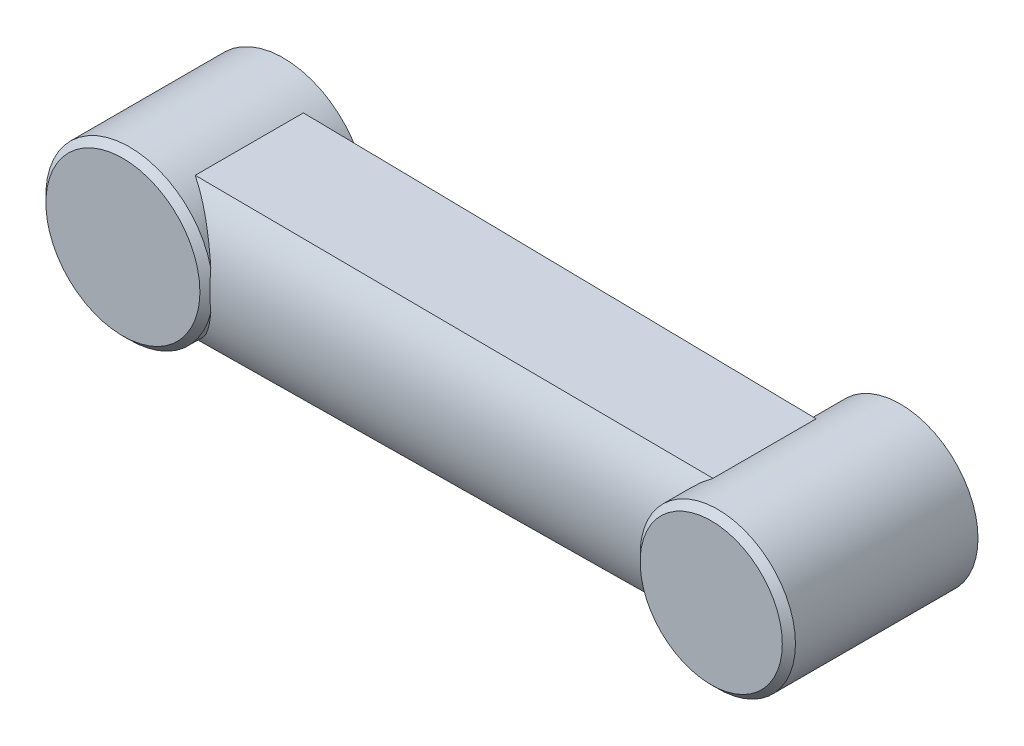
ISO-10303-21;
HEADER;
FILE_DESCRIPTION(('STEP AP214'),'2;1');
FILE_NAME('part.step','',(''),(''),'','','');
FILE_SCHEMA(('AUTOMOTIVE_DESIGN { 1 0 10303 214 1 1 1 1 }'));
ENDSEC;
DATA;
#1=APPLICATION_CONTEXT('core data for automotive mechanical design processes');
#2=APPLICATION_PROTOCOL_DEFINITION('international standard','automotive_design',2000,#1);
#3=PRODUCT_CONTEXT('',#1,'mechanical');
#4=PRODUCT('Part','Part','',(#3));
#5=PRODUCT_RELATED_PRODUCT_CATEGORY('part','',(#4));
#6=PRODUCT_DEFINITION_FORMATION('','',#4);
#7=PRODUCT_DEFINITION_CONTEXT('part definition',#1,'design');
#8=PRODUCT_DEFINITION('design','',#6,#7);
#9=PRODUCT_DEFINITION_SHAPE('','',#8);
#10=(LENGTH_UNIT() NAMED_UNIT(*) SI_UNIT(.MILLI.,.METRE.));
#11=(NAMED_UNIT(*) PLANE_ANGLE_UNIT() SI_UNIT($,.RADIAN.));
#12=(NAMED_UNIT(*) SI_UNIT($,.STERADIAN.) SOLID_ANGLE_UNIT());
#13=UNCERTAINTY_MEASURE_WITH_UNIT(LENGTH_MEASURE(1.E-05),#10,'distance_accuracy_value','');
#14=(GEOMETRIC_REPRESENTATION_CONTEXT(3) GLOBAL_UNCERTAINTY_ASSIGNED_CONTEXT((#13)) GLOBAL_UNIT_ASSIGNED_CONTEXT((#10,
#11,#12)) REPRESENTATION_CONTEXT('',''));
#15=CARTESIAN_POINT('',(0.,0.,0.));
#16=DIRECTION('',(0.,0.,1.));
#17=DIRECTION('',(1.,0.,0.));
#18=AXIS2_PLACEMENT_3D('',#15,#16,#17);
#19=CARTESIAN_POINT('',(0.,0.,-61.));
#20=DIRECTION('',(0.,0.,1.));
#21=DIRECTION('',(1.,0.,0.));
#22=AXIS2_PLACEMENT_3D('',#19,#20,#21);
#23=CYLINDRICAL_SURFACE('',#22,63.5);
#24=CARTESIAN_POINT('',(61.7836507927688,-14.6639181229712,56.));
#25=CARTESIAN_POINT('',(61.648599708457,-15.2329349138538,55.9081096489877));
#26=CARTESIAN_POINT('',(61.5058805607978,-15.7992618023809,55.8111330407212));
#27=CARTESIAN_POINT('',(61.205369992256,-16.9260951506808,55.6073498298629));
#28=CARTESIAN_POINT('',(61.0475791669996,-17.4866018394956,55.5005436157389));
#29=CARTESIAN_POINT('',(60.5523902408362,-19.1574069130503,55.1661611657198));
#30=CARTESIAN_POINT('',(60.1928373582026,-20.2584122556794,54.924390105969));
#31=CARTESIAN_POINT('',(59.417272090624,-22.4314192917344,54.4060788828777));
#32=CARTESIAN_POINT('',(59.0012779951845,-23.5034302462447,54.1295499847762));
#33=CARTESIAN_POINT('',(58.1176008499438,-25.6103993271792,53.5462526207637));
#34=CARTESIAN_POINT('',(57.6502020191451,-26.6455230707687,53.2396513539814));
#35=CARTESIAN_POINT('',(56.6643880440222,-28.6823586781904,52.597913240159));
#36=CARTESIAN_POINT('',(56.1459607726053,-29.6840625235618,52.2627696124868));
#37=CARTESIAN_POINT('',(55.0606092195765,-31.6518877061413,51.5674321038602));
#38=CARTESIAN_POINT('',(54.4936827410106,-32.618007428594,51.2072370882474));
#39=CARTESIAN_POINT('',(53.3162045089535,-34.508948662652,50.4669929407446));
#40=CARTESIAN_POINT('',(52.705851992297,-35.43393068511,50.0870363932428));
#41=CARTESIAN_POINT('',(51.4415188796073,-37.2456753985094,49.3093232153491));
#42=CARTESIAN_POINT('',(50.787541022047,-38.1324404826832,48.911567702758));
#43=CARTESIAN_POINT('',(49.4378008508712,-39.8667957088694,48.1016409412243));
#44=CARTESIAN_POINT('',(48.7420356466458,-40.7143831336017,47.6894686958398));
#45=CARTESIAN_POINT('',(47.3099576867711,-42.3699991378008,46.853839112169));
#46=CARTESIAN_POINT('',(46.5736151317401,-43.1779977986145,46.430373601298));
#47=CARTESIAN_POINT('',(45.0623733214056,-44.7529161066624,45.5762645822608));
#48=CARTESIAN_POINT('',(44.287477486905,-45.5198393859895,45.1456217131831));
#49=CARTESIAN_POINT('',(42.7004908814915,-47.0117409487852,44.2810581898336));
#50=CARTESIAN_POINT('',(41.8884107179383,-47.7367310623682,43.8471384994552));
#51=CARTESIAN_POINT('',(40.4935347604892,-48.9190305082146,43.1185984777713));
#52=CARTESIAN_POINT('',(39.9204812806935,-49.387788233219,42.8238149059094));
#53=CARTESIAN_POINT('',(38.7579424323339,-50.3052689075127,42.2358477801488));
#54=CARTESIAN_POINT('',(38.168460263094,-50.7539957139495,41.9426639278359));
#55=CARTESIAN_POINT('',(36.9748487839182,-51.6300025919728,41.359964940018));
#56=CARTESIAN_POINT('',(36.3707636056516,-52.0573376045213,41.0704420028054));
#57=CARTESIAN_POINT('',(35.1465078677639,-52.8916017941842,40.4955829675822));
#58=CARTESIAN_POINT('',(34.5263339579162,-53.2985266686103,40.2102477612865));
#59=CARTESIAN_POINT('',(33.8982909099262,-53.6950265237481,39.9277307044227));
#60=B_SPLINE_CURVE_WITH_KNOTS('',3,(#24,#25,#26,#27,#28,#29,#30,#31,#32,#33,#34,#35,#36,#37,#38,
#39,#40,#41,#42,#43,#44,#45,#46,#47,#48,#49,#50,#51,#52,#53,#54,#55,#56,#57,#58,#59),
.UNSPECIFIED.,.F.,.F.,(4,2,2,2,2,2,2,2,2,2,2,2,2,2,2,2,2,4),(0.,1.7758306915689,
3.55159123208076,7.09868103501052,10.6446241534672,14.1718634038235,17.6999429485802,
21.2281823956738,24.7411656383265,28.2539285692867,31.7669347736264,35.282556178013,
38.7978661983946,42.3121795989563,44.7024416456266,47.0922414210103,49.4755502822629,
51.8593594783057),.UNSPECIFIED.);
#61=CARTESIAN_POINT('',(61.7836507927688,-14.6639181229711,56.));
#62=VERTEX_POINT('',#61);
#63=CARTESIAN_POINT('',(33.8982909099262,-53.6950265237481,39.9277307044227));
#64=VERTEX_POINT('',#63);
#65=EDGE_CURVE('E185',#62,#64,#60,.T.);
#66=ORIENTED_EDGE('',*,*,#65,.F.);
#67=CARTESIAN_POINT('',(0.,0.,56.));
#68=DIRECTION('',(0.,0.,1.));
#69=DIRECTION('',(1.,0.,0.));
#70=AXIS2_PLACEMENT_3D('',#67,#68,#69);
#71=CIRCLE('',#70,63.5);
#72=CARTESIAN_POINT('',(61.7836507927688,14.6639181229709,56.));
#73=VERTEX_POINT('',#72);
#74=EDGE_CURVE('E229',#62,#73,#71,.F.);
#75=ORIENTED_EDGE('',*,*,#74,.T.);
#76=CARTESIAN_POINT('',(33.8982909099263,53.695026523748,39.9277307044227));
#77=CARTESIAN_POINT('',(34.6854697356567,53.1980495854552,40.281847356795));
#78=CARTESIAN_POINT('',(35.4602930454346,52.6847059542092,40.6403734810635));
#79=CARTESIAN_POINT('',(36.9849087142456,51.6258531577822,41.3636142717385));
#80=CARTESIAN_POINT('',(37.7346964681527,51.0803381253771,41.7283300582858));
#81=CARTESIAN_POINT('',(39.2087424421234,49.9578091687501,42.4612427714828));
#82=CARTESIAN_POINT('',(39.9329968458493,49.3807905684259,42.8294402081741));
#83=CARTESIAN_POINT('',(41.3553781887673,48.1958464111372,43.566752900685));
#84=CARTESIAN_POINT('',(42.0535033016067,47.5879187007045,43.9358682187456));
#85=CARTESIAN_POINT('',(43.4304029852933,46.3349319083394,44.6765401287394));
#86=CARTESIAN_POINT('',(44.1088850914266,45.6895412914754,45.0480797026258));
#87=CARTESIAN_POINT('',(45.4377058514202,44.3682626486409,45.7870903998418));
#88=CARTESIAN_POINT('',(46.0880460995222,43.692376354699,46.1545617527569));
#89=CARTESIAN_POINT('',(47.3597500724767,42.3105851675989,46.8830128553344));
#90=CARTESIAN_POINT('',(47.981115675076,41.6046822254005,47.2439930247339));
#91=CARTESIAN_POINT('',(49.1939225030848,40.1633552652555,47.9571502523404));
#92=CARTESIAN_POINT('',(49.7853635838568,39.4279311046516,48.3093272679939));
#93=CARTESIAN_POINT('',(51.1317334584608,37.6748665861015,49.119834839902));
#94=CARTESIAN_POINT('',(51.874433073056,36.6457816999869,49.5738561529566));
#95=CARTESIAN_POINT('',(53.301335276781,34.5374870647286,50.4570774228577));
#96=CARTESIAN_POINT('',(53.9855338052523,33.4582738441039,50.8862756560247));
#97=CARTESIAN_POINT('',(55.2922877211038,31.2515223427374,51.7146853505287));
#98=CARTESIAN_POINT('',(55.914825308247,30.1239702413805,52.1138881448218));
#99=CARTESIAN_POINT('',(57.0907124871832,27.8307405113999,52.8743298102404));
#100=CARTESIAN_POINT('',(57.6444764190512,26.6653505299609,53.2357937083359));
#101=CARTESIAN_POINT('',(58.6834885354417,24.2935011993655,53.9189561223194));
#102=CARTESIAN_POINT('',(59.1687555542201,23.0870532533946,54.24066556625));
#103=CARTESIAN_POINT('',(60.0668163734702,20.6379783709302,54.8397311426571));
#104=CARTESIAN_POINT('',(60.4796862583333,19.3953910356553,55.1171338108246));
#105=CARTESIAN_POINT('',(60.9400562821911,17.8507393136768,55.4279251481107));
#106=CARTESIAN_POINT('',(61.0234240375354,17.5636349030207,55.4842743265175));
#107=CARTESIAN_POINT('',(61.1862077736948,16.9878613392096,55.5944194893146));
#108=CARTESIAN_POINT('',(61.2656243827675,16.6991924429648,55.6482158795513));
#109=CARTESIAN_POINT('',(61.4204838349234,16.1202964378687,55.7532183185651));
#110=CARTESIAN_POINT('',(61.4959263343745,15.830069196654,55.8044241433271));
#111=CARTESIAN_POINT('',(61.6428057593379,15.2481009289596,55.9042018535729));
#112=CARTESIAN_POINT('',(61.7142420361099,14.9563596656183,55.9527733124239));
#113=CARTESIAN_POINT('',(61.7836507927688,14.6639181229711,56.));
#114=B_SPLINE_CURVE_WITH_KNOTS('',3,(#76,#77,#78,#79,#80,#81,#82,#83,#84,#85,#86,#87,#88,#89,
#90,#91,#92,#93,#94,#95,#96,#97,#98,#99,#100,#101,#102,#103,#104,#105,#106,#107,#108,#109,#110,
#111,#112,#113),.UNSPECIFIED.,.F.,.F.,(4,2,2,2,2,2,2,2,2,2,2,2,2,2,2,2,2,2,4),(0.,
2.98776415405601,5.97607489355973,8.9648304029641,11.953794428026,14.9752169769856,
17.9964681371023,21.0175232274703,24.038592918438,28.079753339509,32.1211940369662,
36.1637980349664,40.1807249946286,44.1965452792267,48.2081195847804,49.1207847112899,
50.0333042513392,50.9459025657545,51.8586482359199),.UNSPECIFIED.);
#115=CARTESIAN_POINT('',(33.8982909099263,53.6950265237481,39.9277307044227));
#116=VERTEX_POINT('',#115);
#117=EDGE_CURVE('E126',#116,#73,#114,.T.);
#118=ORIENTED_EDGE('',*,*,#117,.F.);
#119=DIRECTION('',(0.,0.,1.));
#120=VECTOR('',#119,1.);
#121=CARTESIAN_POINT('',(33.8982909099263,53.6950265237481,-61.));
#122=LINE('',#121,#120);
#123=CARTESIAN_POINT('',(33.8982909099262,53.6950265237481,-42.2424941420733));
#124=VERTEX_POINT('',#123);
#125=EDGE_CURVE('E142',#124,#116,#122,.T.);
#126=ORIENTED_EDGE('',*,*,#125,.F.);
#127=CARTESIAN_POINT('',(33.8982909099262,-53.6950265237481,-42.2424941420734));
#128=CARTESIAN_POINT('',(34.4193198431348,-53.3660911462127,-42.4380515091542));
#129=CARTESIAN_POINT('',(34.9349983197885,-53.0299347012633,-42.6355872701408));
#130=CARTESIAN_POINT('',(35.9554926568176,-52.3433934662191,-43.0339301537555));
#131=CARTESIAN_POINT('',(36.4603087112985,-51.9930089306959,-43.2347372178143));
#132=CARTESIAN_POINT('',(37.9581821875637,-50.9208631898811,-43.8410210917351));
#133=CARTESIAN_POINT('',(38.9347340185612,-50.1780661987484,-44.2503866828712));
#134=CARTESIAN_POINT('',(40.8419686939464,-48.6383175862318,-45.0740107517417));
#135=CARTESIAN_POINT('',(41.7726493888144,-47.8413634312001,-45.4882694576416));
#136=CARTESIAN_POINT('',(43.5917398396207,-46.1901265128991,-46.3189347748675));
#137=CARTESIAN_POINT('',(44.4798724379297,-45.3355374390936,-46.7353398743647));
#138=CARTESIAN_POINT('',(46.2061097871649,-43.5748254432467,-47.5627939271128));
#139=CARTESIAN_POINT('',(47.0442155720717,-42.6687035870684,-47.9738429909278));
#140=CARTESIAN_POINT('',(48.6683542025277,-40.8064662967915,-48.7856126612031));
#141=CARTESIAN_POINT('',(49.4543857730563,-39.8503496396111,-49.1863330146217));
#142=CARTESIAN_POINT('',(50.9733489899942,-37.8881227875249,-49.9735343490851));
#143=CARTESIAN_POINT('',(51.7061815151839,-36.8819248747386,-50.3599881219915));
#144=CARTESIAN_POINT('',(53.1145419440894,-34.8231372441595,-51.1133543756246));
#145=CARTESIAN_POINT('',(53.7900700594988,-33.7705476977684,-51.4802669285386));
#146=CARTESIAN_POINT('',(55.0810318581592,-31.6212191175855,-52.1900804030294));
#147=CARTESIAN_POINT('',(55.6964628687674,-30.5244781233477,-52.5329802565201));
#148=CARTESIAN_POINT('',(56.8628582475973,-28.292179713211,-53.1894582724638));
#149=CARTESIAN_POINT('',(57.4139698348312,-27.1567189453455,-53.5031030516926));
#150=CARTESIAN_POINT('',(58.4502895238229,-24.8478328099913,-54.097923776957));
#151=CARTESIAN_POINT('',(58.9354990124585,-23.6744082420762,-54.3791004062505));
#152=CARTESIAN_POINT('',(59.8369107502925,-21.2935212100263,-54.9052767867625));
#153=CARTESIAN_POINT('',(60.2531207698379,-20.0860625965648,-55.1502806112262));
#154=CARTESIAN_POINT('',(60.9817421524545,-17.7440779773845,-55.581704682793));
#155=CARTESIAN_POINT('',(61.2999333637755,-16.6119360368338,-55.7713159374953));
#156=CARTESIAN_POINT('',(61.8739563491104,-14.3265980753332,-56.1146551107082));
#157=CARTESIAN_POINT('',(62.1297905256461,-13.1734028673744,-56.2683844116863));
#158=CARTESIAN_POINT('',(62.5773227430765,-10.8502500643327,-56.538041927136));
#159=CARTESIAN_POINT('',(62.7690212513804,-9.68029259147507,-56.6539704170928));
#160=CARTESIAN_POINT('',(63.0868166698778,-7.32876562047388,-56.8466073668139));
#161=CARTESIAN_POINT('',(63.2129385987853,-6.14720072634162,-56.9233307838674));
#162=CARTESIAN_POINT('',(63.3987275925882,-3.7768097649935,-57.0365463894842));
#163=CARTESIAN_POINT('',(63.458393593082,-2.58798358178272,-57.0730379336675));
#164=CARTESIAN_POINT('',(63.4977061552108,-0.803495805736164,-57.0970969873179));
#165=CARTESIAN_POINT('',(63.5024459277678,-0.208458218150453,-57.100003622976));
#166=CARTESIAN_POINT('',(63.4952014789657,0.981473846072471,-57.0955679089904));
#167=CARTESIAN_POINT('',(63.4832178167924,1.57636832682955,-57.088225902033));
#168=CARTESIAN_POINT('',(63.4362652842381,2.94895251278201,-57.0595124181981));
#169=CARTESIAN_POINT('',(63.3953420499829,3.72637049836644,-57.03450920508));
#170=CARTESIAN_POINT('',(63.2850158513729,5.27845720616421,-56.9672390962727));
#171=CARTESIAN_POINT('',(63.2156115582514,6.0531257984052,-56.9249713951197));
#172=CARTESIAN_POINT('',(63.0485627109138,7.59818535259573,-56.8234464236458));
#173=CARTESIAN_POINT('',(62.9509220662756,8.36857689170158,-56.7641915053685));
#174=CARTESIAN_POINT('',(62.7277122249248,9.90383079582678,-56.6290239853894));
#175=CARTESIAN_POINT('',(62.6021428213428,10.6686931198477,-56.5531112603027));
#176=CARTESIAN_POINT('',(62.3234902510483,12.1914512697166,-56.3850439118823));
#177=CARTESIAN_POINT('',(62.1704121919835,12.9493483614154,-56.2928923037518));
#178=CARTESIAN_POINT('',(61.8372128666032,14.4570181859871,-56.0927931730675));
#179=CARTESIAN_POINT('',(61.6570915198393,15.2067908946844,-55.9848456035239));
#180=CARTESIAN_POINT('',(61.0769021918049,17.4422191955904,-55.6382269580365));
#181=CARTESIAN_POINT('',(60.6369594386442,18.9142543445134,-55.3767499039783));
#182=CARTESIAN_POINT('',(59.6532544530383,21.8198162752503,-54.7974987987408));
#183=CARTESIAN_POINT('',(59.1089944009907,23.2531191995297,-54.4794553500636));
#184=CARTESIAN_POINT('',(57.9232754026136,26.0667330368434,-53.7942439005121));
#185=CARTESIAN_POINT('',(57.2818168085849,27.4470441419264,-53.4270760776919));
#186=CARTESIAN_POINT('',(55.9065747720781,30.1497267170657,-52.6501083911692));
#187=CARTESIAN_POINT('',(55.1727193589018,31.4720519256856,-52.2402753377832));
#188=CARTESIAN_POINT('',(53.6182617611562,34.0529236710477,-51.3860310199276));
#189=CARTESIAN_POINT('',(52.7976566611284,35.3114680621584,-50.9416185934568));
#190=CARTESIAN_POINT('',(50.9682622815734,37.9119445006428,-49.9695456408328));
#191=CARTESIAN_POINT('',(49.9487453418842,39.245026654486,-49.4383767543475));
#192=CARTESIAN_POINT('',(47.8124500427596,41.8212960525196,-48.3533216488615));
#193=CARTESIAN_POINT('',(46.6956520170626,43.0644650265319,-47.7994308484477));
#194=CARTESIAN_POINT('',(44.3717691842029,45.4551644302404,-46.6818438240084));
#195=CARTESIAN_POINT('',(43.1647967775747,46.6028102743806,-46.1181604576095));
#196=CARTESIAN_POINT('',(40.6643777328724,48.7998600341714,-44.993118572353));
#197=CARTESIAN_POINT('',(39.3709721081893,49.8493099852208,-44.4317590832071));
#198=CARTESIAN_POINT('',(37.3667719378811,51.3485537256723,-43.6003310687549));
#199=CARTESIAN_POINT('',(36.6867167548055,51.8366390838028,-43.3244607615004));
#200=CARTESIAN_POINT('',(35.3071660184593,52.7859246646202,-42.7786789067284));
#201=CARTESIAN_POINT('',(34.6076959599724,53.2471578909702,-42.508760308992));
#202=CARTESIAN_POINT('',(33.8982909099262,53.6950265237481,-42.2424941420734));
#203=B_SPLINE_CURVE_WITH_KNOTS('',3,(#127,#128,#129,#130,#131,#132,#133,#134,#135,#136,#137,
#138,#139,#140,#141,#142,#143,#144,#145,#146,#147,#148,#149,#150,#151,#152,#153,#154,#155,#156,
#157,#158,#159,#160,#161,#162,#163,#164,#165,#166,#167,#168,#169,#170,#171,#172,#173,#174,#175,
#176,#177,#178,#179,#180,#181,#182,#183,#184,#185,#186,#187,#188,#189,#190,#191,#192,#193,#194,
#195,#196,#197,#198,#199,#200,#201,#202),.UNSPECIFIED.,.F.,.F.,(4,2,2,2,2,2,2,2,2,2,2,2,2,2,2,2,
2,2,2,2,2,2,2,2,2,2,2,2,2,2,2,2,2,2,2,2,2,4),(0.,1.93924289755382,3.87845111309315,
7.7566105210312,11.634951486914,15.5358363765017,19.4366406125941,23.3375403233582,
27.245531007154,31.1535072534453,35.0616572164655,38.9606788021854,42.859618322167,
46.7581184659606,50.3294275656358,53.9005990464393,57.4717445006256,61.0415264932291,
64.6113656609748,66.3962867153382,68.1811480882825,70.5170902385374,72.8531413831559,
75.1888692351261,77.5246143885003,79.8599263015221,82.1952451617718,86.8650588132203,
91.5577389328491,96.2504020440397,100.946743293214,105.643242425884,110.918780162621,
116.195386883765,121.465522765927,126.733175435276,129.376716791021,132.016937250426),.UNSPECIFIED.);
#204=CARTESIAN_POINT('',(33.8982909099262,-53.6950265237481,-42.2424941420734));
#205=VERTEX_POINT('',#204);
#206=EDGE_CURVE('E123',#205,#124,#203,.T.);
#207=ORIENTED_EDGE('',*,*,#206,.F.);
#208=DIRECTION('',(0.,0.,1.));
#209=VECTOR('',#208,1.);
#210=CARTESIAN_POINT('',(33.8982909099263,-53.6950265237481,-61.));
#211=LINE('',#210,#209);
#212=EDGE_CURVE('E138',#64,#205,#211,.F.);
#213=ORIENTED_EDGE('',*,*,#212,.F.);
#214=EDGE_LOOP('',(#66,#75,#118,#126,#207,#213));
#215=FACE_BOUND('',#214,.T.);
#216=CARTESIAN_POINT('',(0.,0.,-61.));
#217=DIRECTION('',(0.,0.,1.));
#218=DIRECTION('',(1.,0.,0.));
#219=AXIS2_PLACEMENT_3D('',#216,#217,#218);
#220=CIRCLE('',#219,63.5);
#221=CARTESIAN_POINT('',(63.5,0.,-61.));
#222=VERTEX_POINT('',#221);
#223=EDGE_CURVE('E194',#222,#222,#220,.T.);
#224=ORIENTED_EDGE('',*,*,#223,.T.);
#225=EDGE_LOOP('',(#224));
#226=FACE_BOUND('',#225,.T.);
#227=ADVANCED_FACE('F67',(#215,#226),#23,.T.);
#228=CARTESIAN_POINT('',(0.,0.,-61.));
#229=DIRECTION('',(0.,0.,1.));
#230=DIRECTION('',(1.,0.,0.));
#231=AXIS2_PLACEMENT_3D('',#228,#229,#230);
#232=PLANE('',#231);
#233=ORIENTED_EDGE('',*,*,#223,.F.);
#234=EDGE_LOOP('',(#233));
#235=FACE_BOUND('',#234,.T.);
#236=ADVANCED_FACE('F206',(#235),#232,.F.);
#237=CARTESIAN_POINT('',(0.,0.,61.));
#238=DIRECTION('',(0.,0.,1.));
#239=DIRECTION('',(1.,0.,0.));
#240=AXIS2_PLACEMENT_3D('',#237,#238,#239);
#241=PLANE('',#240);
#242=CARTESIAN_POINT('',(0.,0.,61.));
#243=DIRECTION('',(0.,0.,1.));
#244=DIRECTION('',(1.,0.,0.));
#245=AXIS2_PLACEMENT_3D('',#242,#243,#244);
#246=CIRCLE('',#245,58.5);
#247=CARTESIAN_POINT('',(58.5,0.,61.));
#248=VERTEX_POINT('',#247);
#249=EDGE_CURVE('E233',#248,#248,#246,.T.);
#250=ORIENTED_EDGE('',*,*,#249,.T.);
#251=EDGE_LOOP('',(#250));
#252=FACE_BOUND('',#251,.T.);
#253=ADVANCED_FACE('F241',(#252),#241,.T.);
#254=CARTESIAN_POINT('',(0.,0.,61.));
#255=DIRECTION('',(0.,0.,-1.));
#256=DIRECTION('',(-1.,0.,0.));
#257=AXIS2_PLACEMENT_3D('',#254,#255,#256);
#258=CONICAL_SURFACE('',#257,58.5,0.785398163397446);
#259=CARTESIAN_POINT('',(61.7836507927688,14.6639181229709,56.));
#260=CARTESIAN_POINT('',(61.8407626566548,13.8512186319952,56.1321361155011));
#261=CARTESIAN_POINT('',(61.8939292818548,13.0364457935753,56.2532653461482));
#262=CARTESIAN_POINT('',(61.991413962281,11.4068846705121,56.473005578654));
#263=CARTESIAN_POINT('',(62.0357686979293,10.5921111967361,56.5717101829256));
#264=CARTESIAN_POINT('',(62.115033909838,8.96255191725881,56.7469203476471));
#265=CARTESIAN_POINT('',(62.1499762377268,8.14777572711539,56.8235008416445));
#266=CARTESIAN_POINT('',(62.2100450927694,6.51821831827814,56.9546708621001));
#267=CARTESIAN_POINT('',(62.235196793992,5.70344257186914,57.0093167990488));
#268=CARTESIAN_POINT('',(62.2754575432562,4.07388842978492,57.0967312134052));
#269=CARTESIAN_POINT('',(62.2905839470778,3.25911249349375,57.129537500023));
#270=CARTESIAN_POINT('',(62.3107218713122,1.62955729176192,57.1732913075162));
#271=CARTESIAN_POINT('',(62.3157421799362,0.814778645880914,57.1842578200638));
#272=CARTESIAN_POINT('',(62.3157421799362,-0.814778645881092,57.1842578200638));
#273=CARTESIAN_POINT('',(62.3107218713122,-1.62955729176209,57.1732913075162));
#274=CARTESIAN_POINT('',(62.2905839470778,-3.25911249349393,57.129537500023));
#275=CARTESIAN_POINT('',(62.2754575432562,-4.0738884297851,57.0967312134052));
#276=CARTESIAN_POINT('',(62.2351967939919,-5.70344257186931,57.0093167990488));
#277=CARTESIAN_POINT('',(62.2100450927694,-6.51821831827832,56.9546708621001));
#278=CARTESIAN_POINT('',(62.1499762377268,-8.14777572711557,56.8235008416445));
#279=CARTESIAN_POINT('',(62.115033909838,-8.96255191725899,56.7469203476471));
#280=CARTESIAN_POINT('',(62.0357686979293,-10.5921111967363,56.5717101829255));
#281=CARTESIAN_POINT('',(61.9914139622809,-11.4068846705123,56.473005578654));
#282=CARTESIAN_POINT('',(61.8939292818548,-13.0364457935755,56.2532653461482));
#283=CARTESIAN_POINT('',(61.8407626566547,-13.8512186319954,56.1321361155011));
#284=CARTESIAN_POINT('',(61.7836507927688,-14.6639181229711,56.));
#285=B_SPLINE_CURVE_WITH_KNOTS('',3,(#259,#260,#261,#262,#263,#264,#265,#266,#267,#268,#269,
#270,#271,#272,#273,#274,#275,#276,#277,#278,#279,#280,#281,#282,#283,#284),.UNSPECIFIED.,.F.,
.F.,(4,2,2,2,2,2,2,2,2,2,2,2,4),(0.,2.47597327162048,4.94141353579051,7.39840282961465,
9.84903220825436,12.2954079014581,14.7396553177077,17.1839027339573,19.630278427161,
22.0809078058007,24.5378970996249,27.0033373637949,29.4793106354154),.UNSPECIFIED.);
#286=EDGE_CURVE('E219',#73,#62,#285,.T.);
#287=ORIENTED_EDGE('',*,*,#286,.F.);
#288=ORIENTED_EDGE('',*,*,#74,.F.);
#289=EDGE_LOOP('',(#287,#288));
#290=FACE_BOUND('',#289,.T.);
#291=ORIENTED_EDGE('',*,*,#249,.F.);
#292=EDGE_LOOP('',(#291));
#293=FACE_BOUND('',#292,.T.);
#294=ADVANCED_FACE('F209',(#290,#293),#258,.T.);
#295=CARTESIAN_POINT('',(0.,54.,40.0000000000001));
#296=CARTESIAN_POINT('',(457.5,49.884,39.0246351117086));
#297=CARTESIAN_POINT('',(0.,50.3632176310889,42.6502479131541));
#298=CARTESIAN_POINT('',(457.5,46.4673396309022,41.3925626701944));
#299=CARTESIAN_POINT('',(0.,46.4419690343404,45.0959922608288));
#300=CARTESIAN_POINT('',(457.5,42.8042547910275,43.5695694418785));
#301=CARTESIAN_POINT('',(0.,38.1058227124529,49.4272323731624));
#302=CARTESIAN_POINT('',(457.5,35.0550028031443,47.4152670170387));
#303=CARTESIAN_POINT('',(0.,33.6910257714396,51.3120076630332));
#304=CARTESIAN_POINT('',(457.5,30.9689463374208,49.0833943147892));
#305=CARTESIAN_POINT('',(0.,24.4945415257111,54.3890220544597));
#306=CARTESIAN_POINT('',(457.5,22.4850028776516,51.8023708790877));
#307=CARTESIAN_POINT('',(0.,19.7133096845772,55.5806042377026));
#308=CARTESIAN_POINT('',(457.5,18.0874920759603,52.8527190637673));
#309=CARTESIAN_POINT('',(0.,9.95436304152096,57.1805156499968));
#310=CARTESIAN_POINT('',(457.5,9.12637269259752,54.2621906044295));
#311=CARTESIAN_POINT('',(0.,4.97739747283171,57.5884496870806));
#312=CARTESIAN_POINT('',(457.5,4.56335461529508,54.6210168572468));
#313=CARTESIAN_POINT('',(0.,-4.97739747283176,57.5884496870806));
#314=CARTESIAN_POINT('',(457.5,-4.56335461529508,54.6210168572468));
#315=CARTESIAN_POINT('',(0.,-9.95436304152101,57.1805156499968));
#316=CARTESIAN_POINT('',(457.5,-9.12637269259751,54.2621906044295));
#317=CARTESIAN_POINT('',(0.,-19.7133096845772,55.5806042377026));
#318=CARTESIAN_POINT('',(457.5,-18.0874920759603,52.8527190637673));
#319=CARTESIAN_POINT('',(0.,-24.4945415257111,54.3890220544597));
#320=CARTESIAN_POINT('',(457.5,-22.4850028776516,51.8023708790878));
#321=CARTESIAN_POINT('',(0.,-33.6910257714397,51.3120076630332));
#322=CARTESIAN_POINT('',(457.5,-30.9689463374208,49.0833943147892));
#323=CARTESIAN_POINT('',(0.,-38.1058227124529,49.4272323731624));
#324=CARTESIAN_POINT('',(457.5,-35.0550028031443,47.4152670170387));
#325=CARTESIAN_POINT('',(0.,-46.4419690343405,45.0959922608288));
#326=CARTESIAN_POINT('',(457.5,-42.8042547910275,43.5695694418785));
#327=CARTESIAN_POINT('',(0.,-50.3632176310889,42.6502479131541));
#328=CARTESIAN_POINT('',(457.5,-46.4673396309022,41.3925626701944));
#329=CARTESIAN_POINT('',(0.,-54.,40.0000000000001));
#330=CARTESIAN_POINT('',(457.5,-49.884,39.0246351117086));
#331=B_SPLINE_SURFACE_WITH_KNOTS('',3,1,((#295,#296),(#297,#298),(#299,#300),(#301,#302),(#303,
#304),(#305,#306),(#307,#308),(#309,#310),(#311,#312),(#313,#314),(#315,#316),(#317,#318),(#319,
#320),(#321,#322),(#323,#324),(#325,#326),(#327,#328),(#329,#330)),.UNSPECIFIED.,.F.,.F.,.F.,(4,
2,2,2,2,2,2,2,4),(2,2),(0.,0.125,0.25,0.375,0.5,0.625,0.75,0.875,1.),(0.,1.),.UNSPECIFIED.);
#332=CARTESIAN_POINT('',(426.44149360132,50.1634247264196,39.0908501425809));
#333=CARTESIAN_POINT('',(425.950564004929,49.8594626665734,39.3064124434788));
#334=CARTESIAN_POINT('',(425.464695411678,49.5486740197071,39.5237678558516));
#335=CARTESIAN_POINT('',(424.503180731469,48.9136175779557,39.961351190105));
#336=CARTESIAN_POINT('',(424.0275344666,48.5893500179476,40.1815790618856));
#337=CARTESIAN_POINT('',(422.615993685604,47.5965309665746,40.8455408242648));
#338=CARTESIAN_POINT('',(421.695560681071,46.9080024477247,41.2925248075014));
#339=CARTESIAN_POINT('',(419.897300354642,45.4791825354338,42.1895484068698));
#340=CARTESIAN_POINT('',(419.019476956042,44.7388863907279,42.6395883000435));
#341=CARTESIAN_POINT('',(417.301001718189,43.201621947773,43.5410563392584));
#342=CARTESIAN_POINT('',(416.460703513302,42.4042475801873,43.9924667795542));
#343=CARTESIAN_POINT('',(414.826587004295,40.7593398311122,44.8878281663958));
#344=CARTESIAN_POINT('',(414.032766358407,39.9118089810876,45.3317794879638));
#345=CARTESIAN_POINT('',(412.493529881861,38.1676617076354,46.2071621872814));
#346=CARTESIAN_POINT('',(411.748115177548,37.2710441429172,46.6385932735721));
#347=CARTESIAN_POINT('',(410.306225609526,35.4276796612787,47.485383396141));
#348=CARTESIAN_POINT('',(409.609884613587,34.4808071059508,47.9006971787518));
#349=CARTESIAN_POINT('',(408.271023593849,32.5406969758499,48.7093583430143));
#350=CARTESIAN_POINT('',(407.628503831356,31.5474591760073,49.1027056180142));
#351=CARTESIAN_POINT('',(406.400247330097,29.5164983438244,49.8627426353916));
#352=CARTESIAN_POINT('',(405.814514265138,28.4787724395877,50.2294306526689));
#353=CARTESIAN_POINT('',(404.704841388476,26.3645951812797,50.9301815757724));
#354=CARTESIAN_POINT('',(404.180713793445,25.2882752890239,51.2643430625689));
#355=CARTESIAN_POINT('',(403.195561505182,23.0969898379458,51.8971269907541));
#356=CARTESIAN_POINT('',(402.73453464738,21.9820256064022,52.1957506511666));
#357=CARTESIAN_POINT('',(401.879038356439,19.7173357212411,52.7534170314662));
#358=CARTESIAN_POINT('',(401.484557838306,18.5676158947561,53.0124663427934));
#359=CARTESIAN_POINT('',(400.805383868723,16.3674829940292,53.460711308925));
#360=CARTESIAN_POINT('',(400.513357852795,15.3202592110831,53.6544726344595));
#361=CARTESIAN_POINT('',(399.986494099632,13.2054501947417,54.0050522398591));
#362=CARTESIAN_POINT('',(399.751653098036,12.1378661273504,54.1618726284515));
#363=CARTESIAN_POINT('',(399.340995106345,9.9864598449363,54.4367385723474));
#364=CARTESIAN_POINT('',(399.165177532697,8.90263779056583,54.5547845110056));
#365=CARTESIAN_POINT('',(398.874083007363,6.72379574828647,54.7506435615253));
#366=CARTESIAN_POINT('',(398.758778813096,5.62878102595904,54.8284747774504));
#367=CARTESIAN_POINT('',(398.589587326849,3.43174048475749,54.942878438496));
#368=CARTESIAN_POINT('',(398.535701215308,2.32971453153883,54.9794500906192));
#369=CARTESIAN_POINT('',(398.501287866126,0.675562130579819,55.0028212756183));
#370=CARTESIAN_POINT('',(398.497552164226,0.12400816238321,55.0053643314494));
#371=CARTESIAN_POINT('',(398.50554517145,-0.978971097888408,54.9999335483781));
#372=CARTESIAN_POINT('',(398.51727438538,-1.53039638517535,54.9919593661713));
#373=CARTESIAN_POINT('',(398.561552440135,-2.78470665553341,54.9619161240062));
#374=CARTESIAN_POINT('',(398.598957927243,-3.48734736757544,54.9365616744615));
#375=CARTESIAN_POINT('',(398.698799054904,-4.89012173596496,54.869019963432));
#376=CARTESIAN_POINT('',(398.7612380956,-5.59025503870894,54.8268304153497));
#377=CARTESIAN_POINT('',(398.910910424779,-6.98651987385498,54.7258883220418));
#378=CARTESIAN_POINT('',(398.99813859393,-7.68265220226739,54.6671391966416));
#379=CARTESIAN_POINT('',(399.197092234865,-9.06983713103632,54.5333912560067));
#380=CARTESIAN_POINT('',(399.308817977204,-9.76088967520386,54.4583922613063));
#381=CARTESIAN_POINT('',(399.556373890271,-11.1366302747102,54.2925337464617));
#382=CARTESIAN_POINT('',(399.692199970995,-11.8213193892537,54.2016769175514));
#383=CARTESIAN_POINT('',(399.987507991297,-13.183285073499,54.0045118759356));
#384=CARTESIAN_POINT('',(400.14698998363,-13.8605616266665,53.8982036287722));
#385=CARTESIAN_POINT('',(400.660214028743,-15.8797533782116,53.5568889347234));
#386=CARTESIAN_POINT('',(401.048776365917,-17.2092642503587,53.2994641261249));
#387=CARTESIAN_POINT('',(401.916350714016,-19.8337824680425,52.7289720331311));
#388=CARTESIAN_POINT('',(402.395818445063,-21.1285767414023,52.4156248888398));
#389=CARTESIAN_POINT('',(403.438984478713,-23.6705275723157,51.7400460980336));
#390=CARTESIAN_POINT('',(404.002682192676,-24.9176844627064,51.3778147931469));
#391=CARTESIAN_POINT('',(405.20961032841,-27.3600445184961,50.6101661692228));
#392=CARTESIAN_POINT('',(405.852890719917,-28.5552143983876,50.2047217391372));
#393=CARTESIAN_POINT('',(407.213839771719,-30.8889490440478,49.3577363442294));
#394=CARTESIAN_POINT('',(407.931511600746,-32.0275113955383,48.9161938419655));
#395=CARTESIAN_POINT('',(409.541338994533,-34.3990615000221,47.9406302053767));
#396=CARTESIAN_POINT('',(410.443889224301,-35.6232438181753,47.4022763973598));
#397=CARTESIAN_POINT('',(411.861186651765,-37.3988324398478,46.5741167257931));
#398=CARTESIAN_POINT('',(412.344288562346,-37.9806783807428,46.2945742477254));
#399=CARTESIAN_POINT('',(413.331055626294,-39.1238342250937,45.7298424036613));
#400=CARTESIAN_POINT('',(413.83472063127,-39.6851442766897,45.4446530784227));
#401=CARTESIAN_POINT('',(415.374950043023,-41.3369828872822,44.5830614670801));
#402=CARTESIAN_POINT('',(416.441538816824,-42.3964081608461,44.000170677933));
#403=CARTESIAN_POINT('',(418.650083309949,-44.4289979462501,42.8287183355538));
#404=CARTESIAN_POINT('',(419.792012281498,-45.402192787737,42.2401588575608));
#405=CARTESIAN_POINT('',(421.843724964301,-47.0198591003485,41.2202966720595));
#406=CARTESIAN_POINT('',(422.737186501643,-47.6842620952433,40.78768240826));
#407=CARTESIAN_POINT('',(424.105623277898,-48.6428316257758,40.1453410119365));
#408=CARTESIAN_POINT('',(424.566073714937,-48.9557662410262,39.9325016618974));
#409=CARTESIAN_POINT('',(425.496603279812,-49.5690736770765,39.5094979132203));
#410=CARTESIAN_POINT('',(425.966684087366,-49.8694442782015,39.2993339917726));
#411=CARTESIAN_POINT('',(426.44149360132,-50.1634247264196,39.0908501425809));
#412=B_SPLINE_CURVE_WITH_KNOTS('',3,(#332,#333,#334,#335,#336,#337,#338,#339,#340,#341,#342,
#343,#344,#345,#346,#347,#348,#349,#350,#351,#352,#353,#354,#355,#356,#357,#358,#359,#360,#361,
#362,#363,#364,#365,#366,#367,#368,#369,#370,#371,#372,#373,#374,#375,#376,#377,#378,#379,#380,
#381,#382,#383,#384,#385,#386,#387,#388,#389,#390,#391,#392,#393,#394,#395,#396,#397,#398,#399,
#400,#401,#402,#403,#404,#405,#406,#407,#408,#409,#410,#411),.UNSPECIFIED.,.F.,.F.,(4,2,2,2,2,2,
2,2,2,2,2,2,2,2,2,2,2,2,2,2,2,2,2,2,2,2,2,2,2,2,2,2,2,2,2,2,2,2,2,4),(0.,1.84887995368855,
3.69772770319857,7.39566225072136,11.0939366435775,14.8218030943452,18.5494815549067,
22.2772467226984,26.0148159149684,29.7524032523092,33.4902322312005,37.2163548080035,
40.9423495339523,44.6677229859976,47.9784680809713,51.2890241403656,54.5995474680119,
57.9085791464527,61.2176744224753,62.8721277064499,64.5266349965149,66.6382378084797,
68.7501275228459,70.8615814163776,72.9730586302779,75.0841778530694,77.1953017839045,
81.4168346526219,85.6601186682451,89.903373031105,94.1493053740383,98.3954186484557,
103.230447284213,105.648814322282,108.067163911497,112.899829174099,117.73078784963,
121.312600436525,123.100475778073,124.888665659488),.UNSPECIFIED.);
#413=CARTESIAN_POINT('',(426.44149360132,50.1634247264196,39.0908501425809));
#414=VERTEX_POINT('',#413);
#415=CARTESIAN_POINT('',(426.44149360132,-50.1634247264196,39.0908501425809));
#416=VERTEX_POINT('',#415);
#417=EDGE_CURVE('E90',#414,#416,#412,.T.);
#418=DIRECTION('',(-0.999957259648106,0.00899633678844055,0.00213185399093525));
#419=VECTOR('',#418,1.);
#420=CARTESIAN_POINT('',(228.75,51.942,39.5123175558544));
#421=LINE('',#420,#419);
#422=EDGE_CURVE('E132',#414,#116,#421,.T.);
#423=DIRECTION('',(0.999957259648106,0.00899633678844064,-0.00213185399093526));
#424=VECTOR('',#423,1.);
#425=CARTESIAN_POINT('',(228.75,-51.942,39.5123175558543));
#426=LINE('',#425,#424);
#427=EDGE_CURVE('E193',#64,#416,#426,.T.);
#428=ORIENTED_EDGE('',*,*,#417,.F.);
#429=ORIENTED_EDGE('',*,*,#422,.T.);
#430=ORIENTED_EDGE('',*,*,#117,.T.);
#431=ORIENTED_EDGE('',*,*,#286,.T.);
#432=ORIENTED_EDGE('',*,*,#65,.T.);
#433=ORIENTED_EDGE('',*,*,#427,.T.);
#434=EDGE_LOOP('',(#428,#429,#430,#431,#432,#433));
#435=FACE_BOUND('',#434,.T.);
#436=ADVANCED_FACE('F165',(#435),#331,.T.);
#437=CARTESIAN_POINT('',(0.485783631009537,-53.9956295400541,0.));
#438=DIRECTION('',(0.00899635723179256,-0.999959531959448,0.));
#439=DIRECTION('',(0.999959531959448,0.00899635723179256,0.));
#440=AXIS2_PLACEMENT_3D('',#437,#438,#439);
#441=PLANE('',#440);
#442=DIRECTION('',(0.,0.,1.));
#443=VECTOR('',#442,1.);
#444=CARTESIAN_POINT('',(426.44149360132,-50.1634247264196,-72.2));
#445=LINE('',#444,#443);
#446=CARTESIAN_POINT('',(426.44149360132,-50.1634247264196,-39.2605687567813));
#447=VERTEX_POINT('',#446);
#448=EDGE_CURVE('E83',#416,#447,#445,.F.);
#449=ORIENTED_EDGE('',*,*,#448,.F.);
#450=ORIENTED_EDGE('',*,*,#427,.F.);
#451=ORIENTED_EDGE('',*,*,#212,.T.);
#452=DIRECTION('',(0.999930683866702,0.00899609769354176,0.00759589943046012));
#453=VECTOR('',#452,1.);
#454=CARTESIAN_POINT('',(0.,-54.,-42.5));
#455=LINE('',#454,#453);
#456=EDGE_CURVE('E127',#205,#447,#455,.T.);
#457=ORIENTED_EDGE('',*,*,#456,.T.);
#458=EDGE_LOOP('',(#449,#450,#451,#457));
#459=FACE_BOUND('',#458,.T.);
#460=ADVANCED_FACE('F251',(#459),#441,.T.);
#461=CARTESIAN_POINT('',(0.485783631009534,53.9956295400541,0.));
#462=DIRECTION('',(0.0089963572317925,0.999959531959448,0.));
#463=DIRECTION('',(-0.999959531959448,0.0089963572317925,0.));
#464=AXIS2_PLACEMENT_3D('',#461,#462,#463);
#465=PLANE('',#464);
#466=DIRECTION('',(0.,0.,1.));
#467=VECTOR('',#466,1.);
#468=CARTESIAN_POINT('',(426.44149360132,50.1634247264196,-72.2));
#469=LINE('',#468,#467);
#470=CARTESIAN_POINT('',(426.44149360132,50.1634247264196,-39.2605687567813));
#471=VERTEX_POINT('',#470);
#472=EDGE_CURVE('E130',#471,#414,#469,.T.);
#473=ORIENTED_EDGE('',*,*,#472,.F.);
#474=DIRECTION('',(0.999930683866702,-0.00899609769354173,0.00759589943046015));
#475=VECTOR('',#474,1.);
#476=CARTESIAN_POINT('',(228.75,51.942,-40.7623175558543));
#477=LINE('',#476,#475);
#478=EDGE_CURVE('E117',#124,#471,#477,.T.);
#479=ORIENTED_EDGE('',*,*,#478,.F.);
#480=ORIENTED_EDGE('',*,*,#125,.T.);
#481=ORIENTED_EDGE('',*,*,#422,.F.);
#482=EDGE_LOOP('',(#473,#479,#480,#481));
#483=FACE_BOUND('',#482,.T.);
#484=ADVANCED_FACE('F131',(#483),#465,.T.);
#485=CARTESIAN_POINT('',(0.,-54.,-42.5));
#486=CARTESIAN_POINT('',(457.5,-49.884,-39.0246351117087));
#487=CARTESIAN_POINT('',(0.,-50.1711755608023,-44.8643399530953));
#488=CARTESIAN_POINT('',(457.5,-46.2974968041119,-41.1264542823046));
#489=CARTESIAN_POINT('',(0.,-46.114282359698,-47.0208301363754));
#490=CARTESIAN_POINT('',(457.5,-42.5155102649275,-43.0372184700882));
#491=CARTESIAN_POINT('',(0.,-37.6176035311979,-50.8106004388007));
#492=CARTESIAN_POINT('',(457.5,-34.6263445542267,-46.3881202843171));
#493=CARTESIAN_POINT('',(0.,-33.1779509922579,-52.4434735912207));
#494=CARTESIAN_POINT('',(457.5,-30.5192853598348,-47.8279479108693));
#495=CARTESIAN_POINT('',(0.,-24.0212759423499,-55.0962626633887));
#496=CARTESIAN_POINT('',(457.5,-22.0712391303208,-50.164028452512));
#497=CARTESIAN_POINT('',(0.,-19.3045595940781,-56.1158347850709));
#498=CARTESIAN_POINT('',(457.5,-17.730497831914,-51.0600248059703));
#499=CARTESIAN_POINT('',(0.,-9.72501778926786,-57.482410893644));
#500=CARTESIAN_POINT('',(457.5,-8.92634019370692,-52.26040845106));
#501=CARTESIAN_POINT('',(0.,-4.8626310106137,-57.829217034072));
#502=CARTESIAN_POINT('',(457.5,-4.46326386464884,-52.5646498639059));
#503=CARTESIAN_POINT('',(0.,4.86263101061371,-57.829217034072));
#504=CARTESIAN_POINT('',(457.5,4.46326386464886,-52.5646498639059));
#505=CARTESIAN_POINT('',(0.,9.72501778926787,-57.4824108936441));
#506=CARTESIAN_POINT('',(457.5,8.92634019370694,-52.26040845106));
#507=CARTESIAN_POINT('',(0.,19.3045595940781,-56.1158347850709));
#508=CARTESIAN_POINT('',(457.5,17.730497831914,-51.0600248059703));
#509=CARTESIAN_POINT('',(0.,24.0212759423499,-55.0962626633887));
#510=CARTESIAN_POINT('',(457.5,22.0712391303209,-50.164028452512));
#511=CARTESIAN_POINT('',(0.,33.1779509922579,-52.4434735912207));
#512=CARTESIAN_POINT('',(457.5,30.5192853598348,-47.8279479108692));
#513=CARTESIAN_POINT('',(0.,37.6176035311979,-50.8106004388007));
#514=CARTESIAN_POINT('',(457.5,34.6263445542268,-46.3881202843171));
#515=CARTESIAN_POINT('',(0.,46.114282359698,-47.0208301363753));
#516=CARTESIAN_POINT('',(457.5,42.5155102649275,-43.0372184700882));
#517=CARTESIAN_POINT('',(0.,50.1711755608023,-44.8643399530953));
#518=CARTESIAN_POINT('',(457.5,46.297496804112,-41.1264542823046));
#519=CARTESIAN_POINT('',(0.,54.,-42.5));
#520=CARTESIAN_POINT('',(457.5,49.884,-39.0246351117086));
#521=B_SPLINE_SURFACE_WITH_KNOTS('',3,1,((#485,#486),(#487,#488),(#489,#490),(#491,#492),(#493,
#494),(#495,#496),(#497,#498),(#499,#500),(#501,#502),(#503,#504),(#505,#506),(#507,#508),(#509,
#510),(#511,#512),(#513,#514),(#515,#516),(#517,#518),(#519,#520)),.UNSPECIFIED.,.F.,.F.,.F.,(4,
2,2,2,2,2,2,2,4),(2,2),(0.,0.125,0.25,0.375,0.5,0.625,0.75,0.875,1.),(0.,1.),.UNSPECIFIED.);
#522=CARTESIAN_POINT('',(426.44149360132,-50.1634247264196,-39.2605687567813));
#523=CARTESIAN_POINT('',(425.467417230054,-49.5602986716271,-39.6279653133591));
#524=CARTESIAN_POINT('',(424.512823793192,-48.9300459122316,-40.0022665783503));
#525=CARTESIAN_POINT('',(422.644157803729,-47.6169626070238,-40.7598529044743));
#526=CARTESIAN_POINT('',(421.730086683197,-46.9341302053628,-41.1431382823775));
#527=CARTESIAN_POINT('',(419.944046782555,-45.517572304575,-41.9138589560903));
#528=CARTESIAN_POINT('',(419.072080011911,-44.7838443804785,-42.3012944488916));
#529=CARTESIAN_POINT('',(417.367111485318,-43.2627308495558,-43.0778862362975));
#530=CARTESIAN_POINT('',(416.534359416057,-42.4750639222494,-43.4670397926337));
#531=CARTESIAN_POINT('',(414.914990051068,-40.8513352291312,-44.240284518456));
#532=CARTESIAN_POINT('',(414.128371708065,-40.015274562755,-44.6243758027065));
#533=CARTESIAN_POINT('',(412.60322259401,-38.2962096240795,-45.3830097072541));
#534=CARTESIAN_POINT('',(411.864692924383,-37.4132042773978,-45.7575521087237));
#535=CARTESIAN_POINT('',(410.436698198406,-35.6002733581434,-46.4935431137154));
#536=CARTESIAN_POINT('',(409.747324187067,-34.6702659061251,-46.854966841095));
#537=CARTESIAN_POINT('',(408.421578431773,-32.76665706609,-47.5598766316568));
#538=CARTESIAN_POINT('',(407.785206555491,-31.7930557869196,-47.9033627396215));
#539=CARTESIAN_POINT('',(406.568078905415,-29.8043374410813,-48.5683165569592));
#540=CARTESIAN_POINT('',(405.987325610546,-28.7892185268428,-48.8897832847443));
#541=CARTESIAN_POINT('',(404.88549973285,-26.7223253674399,-49.5058572110996));
#542=CARTESIAN_POINT('',(404.364294927389,-25.6706393726222,-49.8005236085346));
#543=CARTESIAN_POINT('',(403.382943647952,-23.5314456115321,-50.3600587298891));
#544=CARTESIAN_POINT('',(402.922795858136,-22.4439386178683,-50.6249280959453));
#545=CARTESIAN_POINT('',(402.066466641931,-20.2367084574767,-51.1214395805461));
#546=CARTESIAN_POINT('',(401.670278203658,-19.1169888381079,-51.3530853410937));
#547=CARTESIAN_POINT('',(400.974578867199,-16.9431211519644,-51.7622548649728));
#548=CARTESIAN_POINT('',(400.669782749072,-15.8912070034947,-51.942670039697));
#549=CARTESIAN_POINT('',(400.118226930958,-13.7672027172019,-52.2704208140911));
#550=CARTESIAN_POINT('',(399.871465034174,-12.6951133447407,-52.4177576658808));
#551=CARTESIAN_POINT('',(399.437675681206,-10.5347182944936,-52.6774868531165));
#552=CARTESIAN_POINT('',(399.250647886209,-9.44641270872299,-52.789879386767));
#553=CARTESIAN_POINT('',(398.937754469293,-7.25839665464845,-52.9783550895091));
#554=CARTESIAN_POINT('',(398.811863659924,-6.15869107399931,-53.05445321108));
#555=CARTESIAN_POINT('',(398.622085691305,-3.95188432212059,-53.1693647559574));
#556=CARTESIAN_POINT('',(398.558199477382,-2.84478303839464,-53.2081776108098));
#557=CARTESIAN_POINT('',(398.509244281335,-1.18249260140157,-53.2379469364663));
#558=CARTESIAN_POINT('',(398.500738255088,-0.628122023525577,-53.2431283744998));
#559=CARTESIAN_POINT('',(398.499353910035,0.480639933570529,-53.2439707856822));
#560=CARTESIAN_POINT('',(398.506474978856,1.03503131112426,-53.2396321318917));
#561=CARTESIAN_POINT('',(398.540948708684,2.31445503326244,-53.2186663823254));
#562=CARTESIAN_POINT('',(398.573872293316,3.03928932239613,-53.1986568488177));
#563=CARTESIAN_POINT('',(398.666367048979,4.48658403814256,-53.1425523756101));
#564=CARTESIAN_POINT('',(398.72593693021,5.20904457795045,-53.1064582144778));
#565=CARTESIAN_POINT('',(398.871524932321,6.65029937025888,-53.0184170100258));
#566=CARTESIAN_POINT('',(398.957542073544,7.36909375755833,-52.9664705539061));
#567=CARTESIAN_POINT('',(399.155735735888,8.80168778027092,-52.8470277487949));
#568=CARTESIAN_POINT('',(399.267909696207,9.51548789759119,-52.7795329220272));
#569=CARTESIAN_POINT('',(399.518057140561,10.9368590572341,-52.6293606648008));
#570=CARTESIAN_POINT('',(399.656027391496,11.6444308685389,-52.5466851369924));
#571=CARTESIAN_POINT('',(399.957335235733,13.0522068744018,-52.3665616032705));
#572=CARTESIAN_POINT('',(400.120672902736,13.7524110475479,-52.2691135544373));
#573=CARTESIAN_POINT('',(400.648059473989,15.8403481127921,-51.9553886590667));
#574=CARTESIAN_POINT('',(401.049527429383,17.2156629739929,-51.71770359846));
#575=CARTESIAN_POINT('',(401.948322544566,19.9262055328011,-51.1902858111835));
#576=CARTESIAN_POINT('',(402.44578070443,21.2613755322545,-50.9004819940038));
#577=CARTESIAN_POINT('',(403.531392558165,23.8830953383602,-50.2747874685536));
#578=CARTESIAN_POINT('',(404.119545683005,25.1696454499964,-49.9388970494373));
#579=CARTESIAN_POINT('',(405.381969778164,27.6893155818371,-49.2268683204338));
#580=CARTESIAN_POINT('',(406.056301792226,28.9223968907613,-48.8507015122024));
#581=CARTESIAN_POINT('',(407.485856381259,31.3296265768084,-48.0653518208907));
#582=CARTESIAN_POINT('',(408.241081817146,32.5037728674492,-47.656167770233));
#583=CARTESIAN_POINT('',(409.922967223694,34.9263852587174,-46.7612388905052));
#584=CARTESIAN_POINT('',(410.859327160051,36.1669283654578,-46.2721921277876));
#585=CARTESIAN_POINT('',(412.331064934628,37.9653510734767,-45.5218094841117));
#586=CARTESIAN_POINT('',(412.832943173851,38.5545301527641,-45.2688313648093));
#587=CARTESIAN_POINT('',(413.858490489007,39.7116637720729,-44.7585343543357));
#588=CARTESIAN_POINT('',(414.382159375782,40.279618496255,-44.5012155008566));
#589=CARTESIAN_POINT('',(415.983776085721,41.9497452510761,-43.7253507813336));
#590=CARTESIAN_POINT('',(417.093518215878,43.0196254553841,-43.2022880311036));
#591=CARTESIAN_POINT('',(419.392505811157,45.0687141660873,-42.1555649356592));
#592=CARTESIAN_POINT('',(420.581717130137,46.047961189628,-41.6319049409338));
#593=CARTESIAN_POINT('',(422.554045631541,47.5463614124492,-40.7988237504225));
#594=CARTESIAN_POINT('',(423.313319433234,48.0952248214651,-40.4859980771761));
#595=CARTESIAN_POINT('',(424.857870872745,49.1565628131986,-39.8674338366528));
#596=CARTESIAN_POINT('',(425.643109135651,49.6690890957493,-39.5616856348021));
#597=CARTESIAN_POINT('',(426.44149360132,50.1634247264196,-39.2605687567813));
#598=B_SPLINE_CURVE_WITH_KNOTS('',3,(#522,#523,#524,#525,#526,#527,#528,#529,#530,#531,#532,
#533,#534,#535,#536,#537,#538,#539,#540,#541,#542,#543,#544,#545,#546,#547,#548,#549,#550,#551,
#552,#553,#554,#555,#556,#557,#558,#559,#560,#561,#562,#563,#564,#565,#566,#567,#568,#569,#570,
#571,#572,#573,#574,#575,#576,#577,#578,#579,#580,#581,#582,#583,#584,#585,#586,#587,#588,#589,
#590,#591,#592,#593,#594,#595,#596,#597),.UNSPECIFIED.,.F.,.F.,(4,2,2,2,2,2,2,2,2,2,2,2,2,2,2,2,
2,2,2,2,2,2,2,2,2,2,2,2,2,2,2,2,2,2,2,2,2,4),(0.,3.60886841079673,7.21786425848635,
10.8270321787686,14.4567174279295,18.086320248246,21.7160061719457,25.352249097904,
28.9884829452878,32.6248787846487,36.2530365801976,39.8811161726609,43.5087977471561,
46.8365125591394,50.1641013852973,53.4916713370042,56.8178692182347,60.1441178101431,
61.8072461819854,63.4703093825685,65.6471843594233,67.823953977265,70.0006429730929,
72.1771189562056,74.3533223399325,76.5295320464664,80.8811653437693,85.2387799643757,
89.5963672459155,93.9570584579939,98.3179039433181,103.20065407391,105.642935397274,
108.085195524384,112.963834775516,117.84039109768,120.802622714406,123.760551431678),.UNSPECIFIED.);
#599=EDGE_CURVE('E122',#447,#471,#598,.T.);
#600=ORIENTED_EDGE('',*,*,#599,.F.);
#601=ORIENTED_EDGE('',*,*,#456,.F.);
#602=ORIENTED_EDGE('',*,*,#206,.T.);
#603=ORIENTED_EDGE('',*,*,#478,.T.);
#604=EDGE_LOOP('',(#600,#601,#602,#603));
#605=FACE_BOUND('',#604,.T.);
#606=ADVANCED_FACE('F119',(#605),#521,.T.);
#607=CARTESIAN_POINT('',(457.5,0.,-72.2));
#608=DIRECTION('',(0.,0.,1.));
#609=DIRECTION('',(1.,0.,0.));
#610=AXIS2_PLACEMENT_3D('',#607,#608,#609);
#611=CYLINDRICAL_SURFACE('',#610,59.);
#612=CARTESIAN_POINT('',(457.5,0.,66.5));
#613=DIRECTION('',(0.,0.,1.));
#614=DIRECTION('',(1.,0.,0.));
#615=AXIS2_PLACEMENT_3D('',#612,#613,#614);
#616=CIRCLE('',#615,59.);
#617=CARTESIAN_POINT('',(516.5,0.,66.5));
#618=VERTEX_POINT('',#617);
#619=EDGE_CURVE('E12',#618,#618,#616,.F.);
#620=ORIENTED_EDGE('',*,*,#619,.T.);
#621=EDGE_LOOP('',(#620));
#622=FACE_BOUND('',#621,.T.);
#623=ORIENTED_EDGE('',*,*,#472,.T.);
#624=ORIENTED_EDGE('',*,*,#417,.T.);
#625=ORIENTED_EDGE('',*,*,#448,.T.);
#626=ORIENTED_EDGE('',*,*,#599,.T.);
#627=EDGE_LOOP('',(#623,#624,#625,#626));
#628=FACE_BOUND('',#627,.T.);
#629=CARTESIAN_POINT('',(457.5,0.,-72.2));
#630=DIRECTION('',(0.,0.,1.));
#631=DIRECTION('',(1.,0.,0.));
#632=AXIS2_PLACEMENT_3D('',#629,#630,#631);
#633=CIRCLE('',#632,59.);
#634=CARTESIAN_POINT('',(516.5,0.,-72.2));
#635=VERTEX_POINT('',#634);
#636=EDGE_CURVE('E134',#635,#635,#633,.T.);
#637=ORIENTED_EDGE('',*,*,#636,.T.);
#638=EDGE_LOOP('',(#637));
#639=FACE_BOUND('',#638,.T.);
#640=ADVANCED_FACE('F136',(#622,#628,#639),#611,.T.);
#641=CARTESIAN_POINT('',(457.5,0.,-72.2));
#642=DIRECTION('',(0.,0.,1.));
#643=DIRECTION('',(1.,0.,0.));
#644=AXIS2_PLACEMENT_3D('',#641,#642,#643);
#645=PLANE('',#644);
#646=ORIENTED_EDGE('',*,*,#636,.F.);
#647=EDGE_LOOP('',(#646));
#648=FACE_BOUND('',#647,.T.);
#649=ADVANCED_FACE('F162',(#648),#645,.F.);
#650=CARTESIAN_POINT('',(457.5,0.,71.5));
#651=DIRECTION('',(0.,0.,1.));
#652=DIRECTION('',(1.,0.,0.));
#653=AXIS2_PLACEMENT_3D('',#650,#651,#652);
#654=PLANE('',#653);
#655=CARTESIAN_POINT('',(457.5,0.,71.5));
#656=DIRECTION('',(0.,0.,1.));
#657=DIRECTION('',(1.,0.,0.));
#658=AXIS2_PLACEMENT_3D('',#655,#656,#657);
#659=CIRCLE('',#658,53.9999999999999);
#660=CARTESIAN_POINT('',(511.5,0.,71.5));
#661=VERTEX_POINT('',#660);
#662=EDGE_CURVE('E76',#661,#661,#659,.T.);
#663=ORIENTED_EDGE('',*,*,#662,.T.);
#664=EDGE_LOOP('',(#663));
#665=FACE_BOUND('',#664,.T.);
#666=ADVANCED_FACE('F275',(#665),#654,.T.);
#667=CARTESIAN_POINT('',(457.5,0.,71.5));
#668=DIRECTION('',(0.,0.,-1.));
#669=DIRECTION('',(-1.,0.,0.));
#670=AXIS2_PLACEMENT_3D('',#667,#668,#669);
#671=CONICAL_SURFACE('',#670,54.,0.785398163397454);
#672=ORIENTED_EDGE('',*,*,#619,.F.);
#673=EDGE_LOOP('',(#672));
#674=FACE_BOUND('',#673,.T.);
#675=ORIENTED_EDGE('',*,*,#662,.F.);
#676=EDGE_LOOP('',(#675));
#677=FACE_BOUND('',#676,.T.);
#678=ADVANCED_FACE('F70',(#674,#677),#671,.T.);
#679=CLOSED_SHELL('',(#227,#236,#253,#294,#436,#460,#484,#606,#640,#649,#666,#678));
#680=MANIFOLD_SOLID_BREP('B2',#679);
#681=ADVANCED_BREP_SHAPE_REPRESENTATION('',(#18,#680),#14);
#682=SHAPE_DEFINITION_REPRESENTATION(#9,#681);
ENDSEC;
END-ISO-10303-21;
